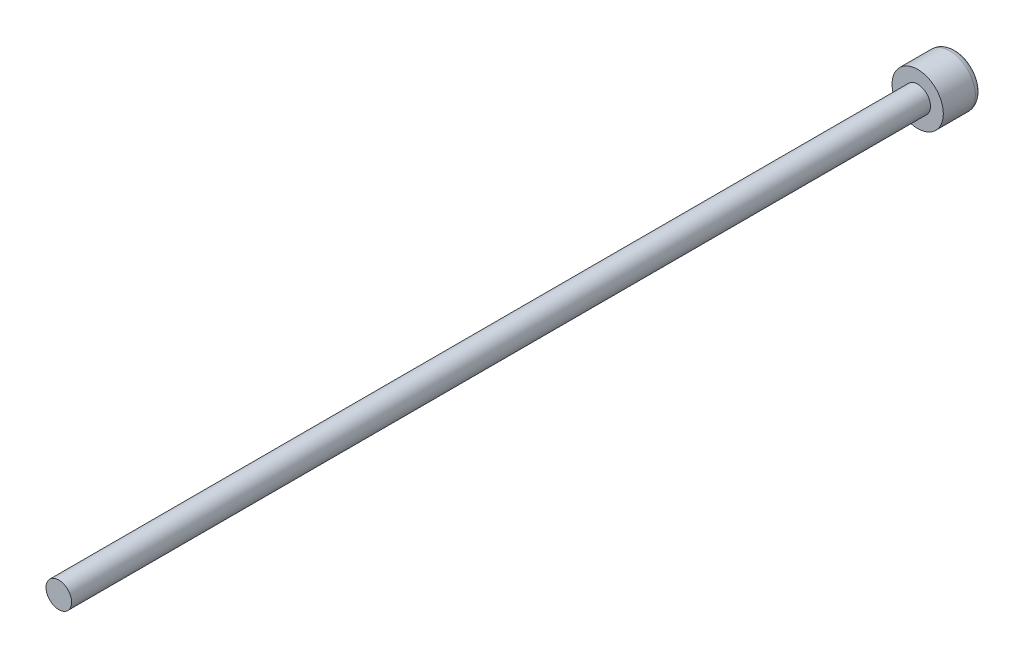
ISO-10303-21;
HEADER;
FILE_DESCRIPTION(('STEP AP214'),'2;1');
FILE_NAME('part.step','',(''),(''),'','','');
FILE_SCHEMA(('AUTOMOTIVE_DESIGN { 1 0 10303 214 1 1 1 1 }'));
ENDSEC;
DATA;
#1=APPLICATION_CONTEXT('core data for automotive mechanical design processes');
#2=APPLICATION_PROTOCOL_DEFINITION('international standard','automotive_design',2000,#1);
#3=PRODUCT_CONTEXT('',#1,'mechanical');
#4=PRODUCT('Part','Part','',(#3));
#5=PRODUCT_RELATED_PRODUCT_CATEGORY('part','',(#4));
#6=PRODUCT_DEFINITION_FORMATION('','',#4);
#7=PRODUCT_DEFINITION_CONTEXT('part definition',#1,'design');
#8=PRODUCT_DEFINITION('design','',#6,#7);
#9=PRODUCT_DEFINITION_SHAPE('','',#8);
#10=(LENGTH_UNIT() NAMED_UNIT(*) SI_UNIT(.MILLI.,.METRE.));
#11=(NAMED_UNIT(*) PLANE_ANGLE_UNIT() SI_UNIT($,.RADIAN.));
#12=(NAMED_UNIT(*) SI_UNIT($,.STERADIAN.) SOLID_ANGLE_UNIT());
#13=UNCERTAINTY_MEASURE_WITH_UNIT(LENGTH_MEASURE(1.E-05),#10,'distance_accuracy_value','');
#14=(GEOMETRIC_REPRESENTATION_CONTEXT(3) GLOBAL_UNCERTAINTY_ASSIGNED_CONTEXT((#13)) GLOBAL_UNIT_ASSIGNED_CONTEXT((#10,
#11,#12)) REPRESENTATION_CONTEXT('',''));
#15=CARTESIAN_POINT('',(0.,0.,0.));
#16=DIRECTION('',(0.,0.,1.));
#17=DIRECTION('',(1.,0.,0.));
#18=AXIS2_PLACEMENT_3D('',#15,#16,#17);
#19=CARTESIAN_POINT('',(0.,0.,70.));
#20=DIRECTION('',(0.,0.,-1.));
#21=DIRECTION('',(-1.,0.,0.));
#22=AXIS2_PLACEMENT_3D('',#19,#20,#21);
#23=CYLINDRICAL_SURFACE('',#22,1.);
#24=CARTESIAN_POINT('',(0.,0.,3.));
#25=DIRECTION('',(0.,0.,1.));
#26=DIRECTION('',(1.,0.,0.));
#27=AXIS2_PLACEMENT_3D('',#24,#25,#26);
#28=CIRCLE('',#27,1.);
#29=CARTESIAN_POINT('',(1.,0.,3.));
#30=VERTEX_POINT('',#29);
#31=EDGE_CURVE('E58',#30,#30,#28,.T.);
#32=ORIENTED_EDGE('',*,*,#31,.T.);
#33=EDGE_LOOP('',(#32));
#34=FACE_BOUND('',#33,.T.);
#35=CARTESIAN_POINT('',(0.,0.,70.));
#36=DIRECTION('',(0.,0.,1.));
#37=DIRECTION('',(1.,0.,0.));
#38=AXIS2_PLACEMENT_3D('',#35,#36,#37);
#39=CIRCLE('',#38,1.);
#40=CARTESIAN_POINT('',(1.,0.,70.));
#41=VERTEX_POINT('',#40);
#42=EDGE_CURVE('E53',#41,#41,#39,.T.);
#43=ORIENTED_EDGE('',*,*,#42,.F.);
#44=EDGE_LOOP('',(#43));
#45=FACE_BOUND('',#44,.T.);
#46=ADVANCED_FACE('F40',(#34,#45),#23,.T.);
#47=CARTESIAN_POINT('',(0.,0.,70.));
#48=DIRECTION('',(0.,0.,1.));
#49=DIRECTION('',(1.,0.,0.));
#50=AXIS2_PLACEMENT_3D('',#47,#48,#49);
#51=PLANE('',#50);
#52=ORIENTED_EDGE('',*,*,#42,.T.);
#53=EDGE_LOOP('',(#52));
#54=FACE_BOUND('',#53,.T.);
#55=ADVANCED_FACE('F73',(#54),#51,.T.);
#56=CARTESIAN_POINT('',(0.,0.,3.));
#57=DIRECTION('',(0.,0.,-1.));
#58=DIRECTION('',(-1.,0.,0.));
#59=AXIS2_PLACEMENT_3D('',#56,#57,#58);
#60=CYLINDRICAL_SURFACE('',#59,2.);
#61=CARTESIAN_POINT('',(0.,0.,0.5));
#62=DIRECTION('',(0.,0.,1.));
#63=DIRECTION('',(1.,0.,0.));
#64=AXIS2_PLACEMENT_3D('',#61,#62,#63);
#65=CIRCLE('',#64,2.);
#66=CARTESIAN_POINT('',(2.,0.,0.5));
#67=VERTEX_POINT('',#66);
#68=EDGE_CURVE('E48',#67,#67,#65,.T.);
#69=ORIENTED_EDGE('',*,*,#68,.T.);
#70=EDGE_LOOP('',(#69));
#71=FACE_BOUND('',#70,.T.);
#72=CARTESIAN_POINT('',(0.,0.,3.));
#73=DIRECTION('',(0.,0.,1.));
#74=DIRECTION('',(1.,0.,0.));
#75=AXIS2_PLACEMENT_3D('',#72,#73,#74);
#76=CIRCLE('',#75,2.);
#77=CARTESIAN_POINT('',(2.,0.,3.));
#78=VERTEX_POINT('',#77);
#79=EDGE_CURVE('E63',#78,#78,#76,.T.);
#80=ORIENTED_EDGE('',*,*,#79,.F.);
#81=EDGE_LOOP('',(#80));
#82=FACE_BOUND('',#81,.T.);
#83=ADVANCED_FACE('F71',(#71,#82),#60,.T.);
#84=CARTESIAN_POINT('',(0.,0.,3.));
#85=DIRECTION('',(0.,0.,1.));
#86=DIRECTION('',(1.,0.,0.));
#87=AXIS2_PLACEMENT_3D('',#84,#85,#86);
#88=PLANE('',#87);
#89=ORIENTED_EDGE('',*,*,#31,.F.);
#90=EDGE_LOOP('',(#89));
#91=FACE_BOUND('',#90,.T.);
#92=ORIENTED_EDGE('',*,*,#79,.T.);
#93=EDGE_LOOP('',(#92));
#94=FACE_BOUND('',#93,.T.);
#95=ADVANCED_FACE('F69',(#91,#94),#88,.T.);
#96=CARTESIAN_POINT('',(0.,0.,0.));
#97=DIRECTION('',(0.,0.,1.));
#98=DIRECTION('',(1.,0.,0.));
#99=AXIS2_PLACEMENT_3D('',#96,#97,#98);
#100=PLANE('',#99);
#101=CARTESIAN_POINT('',(0.,0.,0.));
#102=DIRECTION('',(0.,0.,1.));
#103=DIRECTION('',(1.,0.,0.));
#104=AXIS2_PLACEMENT_3D('',#101,#102,#103);
#105=CIRCLE('',#104,1.5);
#106=CARTESIAN_POINT('',(1.5,0.,0.));
#107=VERTEX_POINT('',#106);
#108=EDGE_CURVE('E10',#107,#107,#105,.F.);
#109=ORIENTED_EDGE('',*,*,#108,.T.);
#110=EDGE_LOOP('',(#109));
#111=FACE_BOUND('',#110,.T.);
#112=ADVANCED_FACE('F80',(#111),#100,.F.);
#113=CARTESIAN_POINT('',(0.,0.,0.5));
#114=DIRECTION('',(0.,0.,1.));
#115=DIRECTION('',(1.,0.,0.));
#116=AXIS2_PLACEMENT_3D('',#113,#114,#115);
#117=TOROIDAL_SURFACE('',#116,1.5,0.5);
#118=ORIENTED_EDGE('',*,*,#108,.F.);
#119=EDGE_LOOP('',(#118));
#120=FACE_BOUND('',#119,.T.);
#121=ORIENTED_EDGE('',*,*,#68,.F.);
#122=EDGE_LOOP('',(#121));
#123=FACE_BOUND('',#122,.T.);
#124=ADVANCED_FACE('F42',(#120,#123),#117,.T.);
#125=CLOSED_SHELL('',(#46,#55,#83,#95,#112,#124));
#126=MANIFOLD_SOLID_BREP('B2',#125);
#127=ADVANCED_BREP_SHAPE_REPRESENTATION('',(#18,#126),#14);
#128=SHAPE_DEFINITION_REPRESENTATION(#9,#127);
ENDSEC;
END-ISO-10303-21;
